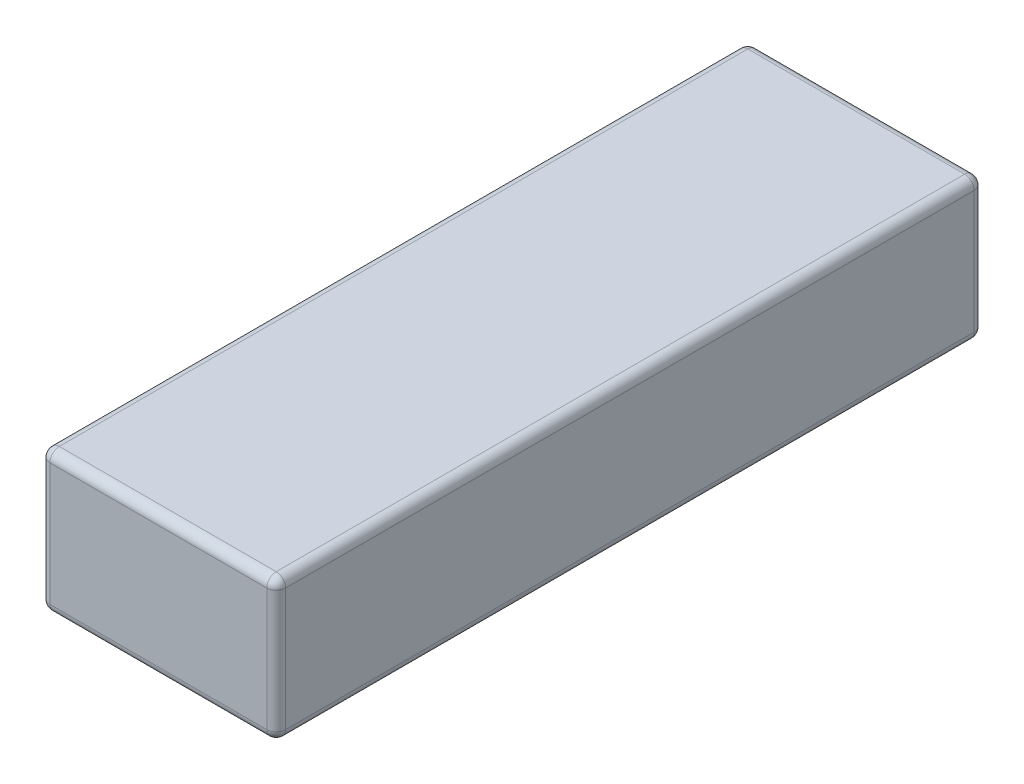
ISO-10303-21;
HEADER;
FILE_DESCRIPTION(('STEP AP214'),'2;1');
FILE_NAME('part.step','',(''),(''),'','','');
FILE_SCHEMA(('AUTOMOTIVE_DESIGN { 1 0 10303 214 1 1 1 1 }'));
ENDSEC;
DATA;
#1=APPLICATION_CONTEXT('core data for automotive mechanical design processes');
#2=APPLICATION_PROTOCOL_DEFINITION('international standard','automotive_design',2000,#1);
#3=PRODUCT_CONTEXT('',#1,'mechanical');
#4=PRODUCT('Part','Part','',(#3));
#5=PRODUCT_RELATED_PRODUCT_CATEGORY('part','',(#4));
#6=PRODUCT_DEFINITION_FORMATION('','',#4);
#7=PRODUCT_DEFINITION_CONTEXT('part definition',#1,'design');
#8=PRODUCT_DEFINITION('design','',#6,#7);
#9=PRODUCT_DEFINITION_SHAPE('','',#8);
#10=(LENGTH_UNIT() NAMED_UNIT(*) SI_UNIT(.MILLI.,.METRE.));
#11=(NAMED_UNIT(*) PLANE_ANGLE_UNIT() SI_UNIT($,.RADIAN.));
#12=(NAMED_UNIT(*) SI_UNIT($,.STERADIAN.) SOLID_ANGLE_UNIT());
#13=UNCERTAINTY_MEASURE_WITH_UNIT(LENGTH_MEASURE(1.E-05),#10,'distance_accuracy_value','');
#14=(GEOMETRIC_REPRESENTATION_CONTEXT(3) GLOBAL_UNCERTAINTY_ASSIGNED_CONTEXT((#13)) GLOBAL_UNIT_ASSIGNED_CONTEXT((#10,
#11,#12)) REPRESENTATION_CONTEXT('',''));
#15=CARTESIAN_POINT('',(0.,0.,0.));
#16=DIRECTION('',(0.,0.,1.));
#17=DIRECTION('',(1.,0.,0.));
#18=AXIS2_PLACEMENT_3D('',#15,#16,#17);
#19=CARTESIAN_POINT('',(-25.,30.,-75.));
#20=DIRECTION('',(0.,0.,1.));
#21=DIRECTION('',(1.,0.,0.));
#22=AXIS2_PLACEMENT_3D('',#19,#20,#21);
#23=PLANE('',#22);
#24=DIRECTION('',(-1.,0.,0.));
#25=VECTOR('',#24,1.);
#26=CARTESIAN_POINT('',(25.,28.,-75.));
#27=LINE('',#26,#25);
#28=CARTESIAN_POINT('',(-23.,28.,-75.));
#29=VERTEX_POINT('',#28);
#30=CARTESIAN_POINT('',(0.,28.,-75.));
#31=VERTEX_POINT('',#30);
#32=EDGE_CURVE('E149',#29,#31,#27,.F.);
#33=ORIENTED_EDGE('',*,*,#32,.T.);
#34=CARTESIAN_POINT('',(0.,15.,-75.));
#35=DIRECTION('',(0.,0.,-1.));
#36=DIRECTION('',(-1.,0.,0.));
#37=AXIS2_PLACEMENT_3D('',#34,#35,#36);
#38=CIRCLE('',#37,13.);
#39=CARTESIAN_POINT('',(0.,2.,-75.));
#40=VERTEX_POINT('',#39);
#41=EDGE_CURVE('E59',#40,#31,#38,.T.);
#42=ORIENTED_EDGE('',*,*,#41,.F.);
#43=DIRECTION('',(-1.,0.,0.));
#44=VECTOR('',#43,1.);
#45=CARTESIAN_POINT('',(-25.,2.,-75.));
#46=LINE('',#45,#44);
#47=CARTESIAN_POINT('',(-23.,2.,-75.));
#48=VERTEX_POINT('',#47);
#49=EDGE_CURVE('E146',#40,#48,#46,.T.);
#50=ORIENTED_EDGE('',*,*,#49,.T.);
#51=DIRECTION('',(0.,-1.,0.));
#52=VECTOR('',#51,1.);
#53=CARTESIAN_POINT('',(-23.,30.,-75.));
#54=LINE('',#53,#52);
#55=EDGE_CURVE('E280',#48,#29,#54,.F.);
#56=ORIENTED_EDGE('',*,*,#55,.T.);
#57=EDGE_LOOP('',(#33,#42,#50,#56));
#58=FACE_BOUND('',#57,.T.);
#59=ADVANCED_FACE('F43',(#58),#23,.F.);
#60=CARTESIAN_POINT('',(25.,30.,-75.));
#61=DIRECTION('',(-1.,0.,0.));
#62=DIRECTION('',(0.,0.,1.));
#63=AXIS2_PLACEMENT_3D('',#60,#61,#62);
#64=PLANE('',#63);
#65=DIRECTION('',(0.,-1.,0.));
#66=VECTOR('',#65,1.);
#67=CARTESIAN_POINT('',(25.,30.,73.));
#68=LINE('',#67,#66);
#69=CARTESIAN_POINT('',(25.,28.,73.));
#70=VERTEX_POINT('',#69);
#71=CARTESIAN_POINT('',(25.,2.,73.));
#72=VERTEX_POINT('',#71);
#73=EDGE_CURVE('E255',#70,#72,#68,.T.);
#74=ORIENTED_EDGE('',*,*,#73,.T.);
#75=DIRECTION('',(0.,0.,-1.));
#76=VECTOR('',#75,1.);
#77=CARTESIAN_POINT('',(25.,2.,-75.));
#78=LINE('',#77,#76);
#79=CARTESIAN_POINT('',(25.,2.,-73.));
#80=VERTEX_POINT('',#79);
#81=EDGE_CURVE('E260',#72,#80,#78,.T.);
#82=ORIENTED_EDGE('',*,*,#81,.T.);
#83=DIRECTION('',(0.,-1.,0.));
#84=VECTOR('',#83,1.);
#85=CARTESIAN_POINT('',(25.,30.,-73.));
#86=LINE('',#85,#84);
#87=CARTESIAN_POINT('',(25.,28.,-73.));
#88=VERTEX_POINT('',#87);
#89=EDGE_CURVE('E250',#80,#88,#86,.F.);
#90=ORIENTED_EDGE('',*,*,#89,.T.);
#91=DIRECTION('',(0.,0.,-1.));
#92=VECTOR('',#91,1.);
#93=CARTESIAN_POINT('',(25.,28.,75.));
#94=LINE('',#93,#92);
#95=EDGE_CURVE('E245',#88,#70,#94,.F.);
#96=ORIENTED_EDGE('',*,*,#95,.T.);
#97=EDGE_LOOP('',(#74,#82,#90,#96));
#98=FACE_BOUND('',#97,.T.);
#99=ADVANCED_FACE('F330',(#98),#64,.F.);
#100=CARTESIAN_POINT('',(23.,2.,-75.));
#101=VERTEX_POINT('',#100);
#102=EDGE_CURVE('E155',#101,#40,#46,.T.);
#103=ORIENTED_EDGE('',*,*,#102,.T.);
#104=EDGE_CURVE('E136',#31,#40,#38,.T.);
#105=ORIENTED_EDGE('',*,*,#104,.F.);
#106=CARTESIAN_POINT('',(23.,28.,-75.));
#107=VERTEX_POINT('',#106);
#108=EDGE_CURVE('E281',#31,#107,#27,.F.);
#109=ORIENTED_EDGE('',*,*,#108,.T.);
#110=DIRECTION('',(0.,-1.,0.));
#111=VECTOR('',#110,1.);
#112=CARTESIAN_POINT('',(23.,30.,-75.));
#113=LINE('',#112,#111);
#114=EDGE_CURVE('E163',#107,#101,#113,.T.);
#115=ORIENTED_EDGE('',*,*,#114,.T.);
#116=EDGE_LOOP('',(#103,#105,#109,#115));
#117=FACE_BOUND('',#116,.T.);
#118=ADVANCED_FACE('F161',(#117),#23,.F.);
#119=CARTESIAN_POINT('',(-25.,30.,-75.));
#120=DIRECTION('',(1.,0.,0.));
#121=DIRECTION('',(0.,0.,-1.));
#122=AXIS2_PLACEMENT_3D('',#119,#120,#121);
#123=PLANE('',#122);
#124=DIRECTION('',(0.,0.,1.));
#125=VECTOR('',#124,1.);
#126=CARTESIAN_POINT('',(-25.,28.,-75.));
#127=LINE('',#126,#125);
#128=CARTESIAN_POINT('',(-25.,28.,73.));
#129=VERTEX_POINT('',#128);
#130=CARTESIAN_POINT('',(-25.,28.,-73.));
#131=VERTEX_POINT('',#130);
#132=EDGE_CURVE('E52',#129,#131,#127,.F.);
#133=ORIENTED_EDGE('',*,*,#132,.T.);
#134=DIRECTION('',(0.,-1.,0.));
#135=VECTOR('',#134,1.);
#136=CARTESIAN_POINT('',(-25.,30.,-73.));
#137=LINE('',#136,#135);
#138=CARTESIAN_POINT('',(-25.,2.,-73.));
#139=VERTEX_POINT('',#138);
#140=EDGE_CURVE('E11',#131,#139,#137,.T.);
#141=ORIENTED_EDGE('',*,*,#140,.T.);
#142=DIRECTION('',(0.,0.,1.));
#143=VECTOR('',#142,1.);
#144=CARTESIAN_POINT('',(-25.,2.,-75.));
#145=LINE('',#144,#143);
#146=CARTESIAN_POINT('',(-25.,2.,73.));
#147=VERTEX_POINT('',#146);
#148=EDGE_CURVE('E177',#139,#147,#145,.T.);
#149=ORIENTED_EDGE('',*,*,#148,.T.);
#150=DIRECTION('',(0.,-1.,0.));
#151=VECTOR('',#150,1.);
#152=CARTESIAN_POINT('',(-25.,30.,73.));
#153=LINE('',#152,#151);
#154=EDGE_CURVE('E179',#147,#129,#153,.F.);
#155=ORIENTED_EDGE('',*,*,#154,.T.);
#156=EDGE_LOOP('',(#133,#141,#149,#155));
#157=FACE_BOUND('',#156,.T.);
#158=ADVANCED_FACE('F339',(#157),#123,.F.);
#159=CARTESIAN_POINT('',(-25.,30.,75.));
#160=DIRECTION('',(0.,0.,-1.));
#161=DIRECTION('',(-1.,0.,0.));
#162=AXIS2_PLACEMENT_3D('',#159,#160,#161);
#163=PLANE('',#162);
#164=DIRECTION('',(1.,0.,0.));
#165=VECTOR('',#164,1.);
#166=CARTESIAN_POINT('',(-25.,2.,75.));
#167=LINE('',#166,#165);
#168=CARTESIAN_POINT('',(-23.,2.,75.));
#169=VERTEX_POINT('',#168);
#170=CARTESIAN_POINT('',(23.,2.,75.));
#171=VERTEX_POINT('',#170);
#172=EDGE_CURVE('E276',#169,#171,#167,.T.);
#173=ORIENTED_EDGE('',*,*,#172,.T.);
#174=DIRECTION('',(0.,-1.,0.));
#175=VECTOR('',#174,1.);
#176=CARTESIAN_POINT('',(23.,30.,75.));
#177=LINE('',#176,#175);
#178=CARTESIAN_POINT('',(23.,28.,75.));
#179=VERTEX_POINT('',#178);
#180=EDGE_CURVE('E278',#171,#179,#177,.F.);
#181=ORIENTED_EDGE('',*,*,#180,.T.);
#182=DIRECTION('',(1.,0.,0.));
#183=VECTOR('',#182,1.);
#184=CARTESIAN_POINT('',(-25.,28.,75.));
#185=LINE('',#184,#183);
#186=CARTESIAN_POINT('',(-23.,28.,75.));
#187=VERTEX_POINT('',#186);
#188=EDGE_CURVE('E274',#179,#187,#185,.F.);
#189=ORIENTED_EDGE('',*,*,#188,.T.);
#190=DIRECTION('',(0.,-1.,0.));
#191=VECTOR('',#190,1.);
#192=CARTESIAN_POINT('',(-23.,30.,75.));
#193=LINE('',#192,#191);
#194=EDGE_CURVE('E272',#187,#169,#193,.T.);
#195=ORIENTED_EDGE('',*,*,#194,.T.);
#196=EDGE_LOOP('',(#173,#181,#189,#195));
#197=FACE_BOUND('',#196,.T.);
#198=ADVANCED_FACE('F344',(#197),#163,.F.);
#199=CARTESIAN_POINT('',(0.,30.,0.));
#200=DIRECTION('',(0.,1.,0.));
#201=DIRECTION('',(0.,0.,1.));
#202=AXIS2_PLACEMENT_3D('',#199,#200,#201);
#203=PLANE('',#202);
#204=DIRECTION('',(1.,0.,0.));
#205=VECTOR('',#204,1.);
#206=CARTESIAN_POINT('',(25.,30.,73.));
#207=LINE('',#206,#205);
#208=CARTESIAN_POINT('',(-23.,30.,73.));
#209=VERTEX_POINT('',#208);
#210=CARTESIAN_POINT('',(23.,30.,73.));
#211=VERTEX_POINT('',#210);
#212=EDGE_CURVE('E172',#209,#211,#207,.T.);
#213=ORIENTED_EDGE('',*,*,#212,.T.);
#214=DIRECTION('',(0.,0.,-1.));
#215=VECTOR('',#214,1.);
#216=CARTESIAN_POINT('',(23.,30.,-75.));
#217=LINE('',#216,#215);
#218=CARTESIAN_POINT('',(23.,30.,-73.));
#219=VERTEX_POINT('',#218);
#220=EDGE_CURVE('E175',#211,#219,#217,.T.);
#221=ORIENTED_EDGE('',*,*,#220,.T.);
#222=DIRECTION('',(-1.,0.,0.));
#223=VECTOR('',#222,1.);
#224=CARTESIAN_POINT('',(-25.,30.,-73.));
#225=LINE('',#224,#223);
#226=CARTESIAN_POINT('',(-23.,30.,-73.));
#227=VERTEX_POINT('',#226);
#228=EDGE_CURVE('E170',#219,#227,#225,.T.);
#229=ORIENTED_EDGE('',*,*,#228,.T.);
#230=DIRECTION('',(0.,0.,1.));
#231=VECTOR('',#230,1.);
#232=CARTESIAN_POINT('',(-23.,30.,75.));
#233=LINE('',#232,#231);
#234=EDGE_CURVE('E164',#227,#209,#233,.T.);
#235=ORIENTED_EDGE('',*,*,#234,.T.);
#236=EDGE_LOOP('',(#213,#221,#229,#235));
#237=FACE_BOUND('',#236,.T.);
#238=ADVANCED_FACE('F348',(#237),#203,.T.);
#239=CARTESIAN_POINT('',(0.,0.,0.));
#240=DIRECTION('',(0.,1.,0.));
#241=DIRECTION('',(0.,0.,1.));
#242=AXIS2_PLACEMENT_3D('',#239,#240,#241);
#243=PLANE('',#242);
#244=DIRECTION('',(-1.,0.,0.));
#245=VECTOR('',#244,1.);
#246=CARTESIAN_POINT('',(0.,0.,-73.));
#247=LINE('',#246,#245);
#248=CARTESIAN_POINT('',(-23.,0.,-73.));
#249=VERTEX_POINT('',#248);
#250=CARTESIAN_POINT('',(23.,0.,-73.));
#251=VERTEX_POINT('',#250);
#252=EDGE_CURVE('E265',#249,#251,#247,.F.);
#253=ORIENTED_EDGE('',*,*,#252,.T.);
#254=DIRECTION('',(0.,0.,-1.));
#255=VECTOR('',#254,1.);
#256=CARTESIAN_POINT('',(23.,0.,0.));
#257=LINE('',#256,#255);
#258=CARTESIAN_POINT('',(23.,0.,73.));
#259=VERTEX_POINT('',#258);
#260=EDGE_CURVE('E269',#251,#259,#257,.F.);
#261=ORIENTED_EDGE('',*,*,#260,.T.);
#262=DIRECTION('',(1.,0.,0.));
#263=VECTOR('',#262,1.);
#264=CARTESIAN_POINT('',(0.,0.,73.));
#265=LINE('',#264,#263);
#266=CARTESIAN_POINT('',(-23.,0.,73.));
#267=VERTEX_POINT('',#266);
#268=EDGE_CURVE('E267',#259,#267,#265,.F.);
#269=ORIENTED_EDGE('',*,*,#268,.T.);
#270=DIRECTION('',(0.,0.,1.));
#271=VECTOR('',#270,1.);
#272=CARTESIAN_POINT('',(-23.,0.,0.));
#273=LINE('',#272,#271);
#274=EDGE_CURVE('E263',#267,#249,#273,.F.);
#275=ORIENTED_EDGE('',*,*,#274,.T.);
#276=EDGE_LOOP('',(#253,#261,#269,#275));
#277=FACE_BOUND('',#276,.T.);
#278=ADVANCED_FACE('F303',(#277),#243,.F.);
#279=CARTESIAN_POINT('',(-23.,28.,0.));
#280=DIRECTION('',(0.,0.,-1.));
#281=DIRECTION('',(-1.,0.,0.));
#282=AXIS2_PLACEMENT_3D('',#279,#280,#281);
#283=CYLINDRICAL_SURFACE('',#282,2.);
#284=CARTESIAN_POINT('',(-23.,28.,73.));
#285=DIRECTION('',(0.,0.,1.));
#286=DIRECTION('',(1.,0.,0.));
#287=AXIS2_PLACEMENT_3D('',#284,#285,#286);
#288=CIRCLE('',#287,2.);
#289=EDGE_CURVE('E47',#209,#129,#288,.T.);
#290=ORIENTED_EDGE('',*,*,#289,.F.);
#291=ORIENTED_EDGE('',*,*,#234,.F.);
#292=CARTESIAN_POINT('',(-23.,28.,-73.));
#293=DIRECTION('',(0.,0.,-1.));
#294=DIRECTION('',(-1.,0.,0.));
#295=AXIS2_PLACEMENT_3D('',#292,#293,#294);
#296=CIRCLE('',#295,2.);
#297=EDGE_CURVE('E239',#131,#227,#296,.T.);
#298=ORIENTED_EDGE('',*,*,#297,.F.);
#299=ORIENTED_EDGE('',*,*,#132,.F.);
#300=EDGE_LOOP('',(#290,#291,#298,#299));
#301=FACE_BOUND('',#300,.T.);
#302=ADVANCED_FACE('F45',(#301),#283,.T.);
#303=CARTESIAN_POINT('',(-23.,28.,73.));
#304=DIRECTION('',(-1.,0.,0.));
#305=DIRECTION('',(0.,0.,1.));
#306=AXIS2_PLACEMENT_3D('',#303,#304,#305);
#307=SPHERICAL_SURFACE('',#306,2.);
#308=CARTESIAN_POINT('',(-23.,28.,73.));
#309=DIRECTION('',(-1.,0.,0.));
#310=DIRECTION('',(0.,0.,1.));
#311=AXIS2_PLACEMENT_3D('',#308,#309,#310);
#312=CIRCLE('',#311,2.);
#313=EDGE_CURVE('E234',#209,#187,#312,.F.);
#314=ORIENTED_EDGE('',*,*,#313,.F.);
#315=ORIENTED_EDGE('',*,*,#289,.T.);
#316=CARTESIAN_POINT('',(-23.,28.,73.));
#317=DIRECTION('',(0.,1.,0.));
#318=DIRECTION('',(0.,0.,1.));
#319=AXIS2_PLACEMENT_3D('',#316,#317,#318);
#320=CIRCLE('',#319,2.);
#321=EDGE_CURVE('E237',#187,#129,#320,.F.);
#322=ORIENTED_EDGE('',*,*,#321,.F.);
#323=EDGE_LOOP('',(#314,#315,#322));
#324=FACE_BOUND('',#323,.T.);
#325=ADVANCED_FACE('F320',(#324),#307,.T.);
#326=CARTESIAN_POINT('',(-23.,28.,-73.));
#327=DIRECTION('',(0.,1.,0.));
#328=DIRECTION('',(0.,0.,1.));
#329=AXIS2_PLACEMENT_3D('',#326,#327,#328);
#330=SPHERICAL_SURFACE('',#329,2.);
#331=CARTESIAN_POINT('',(-23.,28.,-73.));
#332=DIRECTION('',(0.,1.,0.));
#333=DIRECTION('',(0.,0.,1.));
#334=AXIS2_PLACEMENT_3D('',#331,#332,#333);
#335=CIRCLE('',#334,2.);
#336=EDGE_CURVE('E228',#131,#29,#335,.F.);
#337=ORIENTED_EDGE('',*,*,#336,.F.);
#338=ORIENTED_EDGE('',*,*,#297,.T.);
#339=CARTESIAN_POINT('',(-23.,28.,-73.));
#340=DIRECTION('',(-1.,0.,0.));
#341=DIRECTION('',(0.,0.,1.));
#342=AXIS2_PLACEMENT_3D('',#339,#340,#341);
#343=CIRCLE('',#342,2.);
#344=EDGE_CURVE('E231',#29,#227,#343,.F.);
#345=ORIENTED_EDGE('',*,*,#344,.F.);
#346=EDGE_LOOP('',(#337,#338,#345));
#347=FACE_BOUND('',#346,.T.);
#348=ADVANCED_FACE('F317',(#347),#330,.T.);
#349=CARTESIAN_POINT('',(-23.,30.,73.));
#350=DIRECTION('',(0.,-1.,0.));
#351=DIRECTION('',(0.,0.,-1.));
#352=AXIS2_PLACEMENT_3D('',#349,#350,#351);
#353=CYLINDRICAL_SURFACE('',#352,2.);
#354=ORIENTED_EDGE('',*,*,#321,.T.);
#355=ORIENTED_EDGE('',*,*,#154,.F.);
#356=CARTESIAN_POINT('',(-23.,2.,73.));
#357=DIRECTION('',(0.,-1.,0.));
#358=DIRECTION('',(0.,0.,-1.));
#359=AXIS2_PLACEMENT_3D('',#356,#357,#358);
#360=CIRCLE('',#359,2.);
#361=EDGE_CURVE('E222',#169,#147,#360,.T.);
#362=ORIENTED_EDGE('',*,*,#361,.F.);
#363=ORIENTED_EDGE('',*,*,#194,.F.);
#364=EDGE_LOOP('',(#354,#355,#362,#363));
#365=FACE_BOUND('',#364,.T.);
#366=ADVANCED_FACE('F319',(#365),#353,.T.);
#367=CARTESIAN_POINT('',(0.,28.,73.));
#368=DIRECTION('',(-1.,0.,0.));
#369=DIRECTION('',(0.,0.,1.));
#370=AXIS2_PLACEMENT_3D('',#367,#368,#369);
#371=CYLINDRICAL_SURFACE('',#370,2.);
#372=ORIENTED_EDGE('',*,*,#313,.T.);
#373=ORIENTED_EDGE('',*,*,#188,.F.);
#374=CARTESIAN_POINT('',(23.,28.,73.));
#375=DIRECTION('',(1.,0.,0.));
#376=DIRECTION('',(0.,0.,-1.));
#377=AXIS2_PLACEMENT_3D('',#374,#375,#376);
#378=CIRCLE('',#377,2.);
#379=EDGE_CURVE('E219',#211,#179,#378,.T.);
#380=ORIENTED_EDGE('',*,*,#379,.F.);
#381=ORIENTED_EDGE('',*,*,#212,.F.);
#382=EDGE_LOOP('',(#372,#373,#380,#381));
#383=FACE_BOUND('',#382,.T.);
#384=ADVANCED_FACE('F326',(#383),#371,.T.);
#385=CARTESIAN_POINT('',(23.,28.,0.));
#386=DIRECTION('',(0.,0.,1.));
#387=DIRECTION('',(1.,0.,0.));
#388=AXIS2_PLACEMENT_3D('',#385,#386,#387);
#389=CYLINDRICAL_SURFACE('',#388,2.);
#390=CARTESIAN_POINT('',(23.,28.,-73.));
#391=DIRECTION('',(0.,0.,-1.));
#392=DIRECTION('',(-1.,0.,0.));
#393=AXIS2_PLACEMENT_3D('',#390,#391,#392);
#394=CIRCLE('',#393,2.);
#395=EDGE_CURVE('E214',#219,#88,#394,.T.);
#396=ORIENTED_EDGE('',*,*,#395,.F.);
#397=ORIENTED_EDGE('',*,*,#220,.F.);
#398=CARTESIAN_POINT('',(23.,28.,73.));
#399=DIRECTION('',(0.,0.,1.));
#400=DIRECTION('',(1.,0.,0.));
#401=AXIS2_PLACEMENT_3D('',#398,#399,#400);
#402=CIRCLE('',#401,2.);
#403=EDGE_CURVE('E217',#70,#211,#402,.T.);
#404=ORIENTED_EDGE('',*,*,#403,.F.);
#405=ORIENTED_EDGE('',*,*,#95,.F.);
#406=EDGE_LOOP('',(#396,#397,#404,#405));
#407=FACE_BOUND('',#406,.T.);
#408=ADVANCED_FACE('F473',(#407),#389,.T.);
#409=CARTESIAN_POINT('',(0.,28.,-73.));
#410=DIRECTION('',(1.,0.,0.));
#411=DIRECTION('',(0.,0.,-1.));
#412=AXIS2_PLACEMENT_3D('',#409,#410,#411);
#413=CYLINDRICAL_SURFACE('',#412,2.);
#414=ORIENTED_EDGE('',*,*,#344,.T.);
#415=ORIENTED_EDGE('',*,*,#228,.F.);
#416=CARTESIAN_POINT('',(23.,28.,-73.));
#417=DIRECTION('',(1.,0.,0.));
#418=DIRECTION('',(0.,0.,-1.));
#419=AXIS2_PLACEMENT_3D('',#416,#417,#418);
#420=CIRCLE('',#419,2.);
#421=EDGE_CURVE('E211',#107,#219,#420,.T.);
#422=ORIENTED_EDGE('',*,*,#421,.F.);
#423=ORIENTED_EDGE('',*,*,#108,.F.);
#424=ORIENTED_EDGE('',*,*,#32,.F.);
#425=EDGE_LOOP('',(#414,#415,#422,#423,#424));
#426=FACE_BOUND('',#425,.T.);
#427=ADVANCED_FACE('F286',(#426),#413,.T.);
#428=CARTESIAN_POINT('',(-23.,30.,-73.));
#429=DIRECTION('',(0.,-1.,0.));
#430=DIRECTION('',(0.,0.,-1.));
#431=AXIS2_PLACEMENT_3D('',#428,#429,#430);
#432=CYLINDRICAL_SURFACE('',#431,2.);
#433=ORIENTED_EDGE('',*,*,#336,.T.);
#434=ORIENTED_EDGE('',*,*,#55,.F.);
#435=CARTESIAN_POINT('',(-23.,2.,-73.));
#436=DIRECTION('',(0.,-1.,0.));
#437=DIRECTION('',(0.,0.,-1.));
#438=AXIS2_PLACEMENT_3D('',#435,#436,#437);
#439=CIRCLE('',#438,2.);
#440=EDGE_CURVE('E208',#139,#48,#439,.T.);
#441=ORIENTED_EDGE('',*,*,#440,.F.);
#442=ORIENTED_EDGE('',*,*,#140,.F.);
#443=EDGE_LOOP('',(#433,#434,#441,#442));
#444=FACE_BOUND('',#443,.T.);
#445=ADVANCED_FACE('F316',(#444),#432,.T.);
#446=CARTESIAN_POINT('',(-23.,2.,-75.));
#447=DIRECTION('',(0.,0.,1.));
#448=DIRECTION('',(1.,0.,0.));
#449=AXIS2_PLACEMENT_3D('',#446,#447,#448);
#450=CYLINDRICAL_SURFACE('',#449,2.);
#451=CARTESIAN_POINT('',(-23.,2.,73.));
#452=DIRECTION('',(0.,0.,1.));
#453=DIRECTION('',(1.,0.,0.));
#454=AXIS2_PLACEMENT_3D('',#451,#452,#453);
#455=CIRCLE('',#454,2.);
#456=EDGE_CURVE('E225',#147,#267,#455,.T.);
#457=ORIENTED_EDGE('',*,*,#456,.F.);
#458=ORIENTED_EDGE('',*,*,#148,.F.);
#459=CARTESIAN_POINT('',(-23.,2.,-73.));
#460=DIRECTION('',(0.,0.,-1.));
#461=DIRECTION('',(-1.,0.,0.));
#462=AXIS2_PLACEMENT_3D('',#459,#460,#461);
#463=CIRCLE('',#462,2.);
#464=EDGE_CURVE('E206',#249,#139,#463,.T.);
#465=ORIENTED_EDGE('',*,*,#464,.F.);
#466=ORIENTED_EDGE('',*,*,#274,.F.);
#467=EDGE_LOOP('',(#457,#458,#465,#466));
#468=FACE_BOUND('',#467,.T.);
#469=ADVANCED_FACE('F310',(#468),#450,.T.);
#470=CARTESIAN_POINT('',(-23.,2.,73.));
#471=DIRECTION('',(-1.,0.,0.));
#472=DIRECTION('',(0.,-1.,0.));
#473=AXIS2_PLACEMENT_3D('',#470,#471,#472);
#474=SPHERICAL_SURFACE('',#473,2.);
#475=ORIENTED_EDGE('',*,*,#361,.T.);
#476=ORIENTED_EDGE('',*,*,#456,.T.);
#477=CARTESIAN_POINT('',(-23.,2.,73.));
#478=DIRECTION('',(-1.,0.,0.));
#479=DIRECTION('',(0.,0.,1.));
#480=AXIS2_PLACEMENT_3D('',#477,#478,#479);
#481=CIRCLE('',#480,2.);
#482=EDGE_CURVE('E203',#169,#267,#481,.F.);
#483=ORIENTED_EDGE('',*,*,#482,.F.);
#484=EDGE_LOOP('',(#475,#476,#483));
#485=FACE_BOUND('',#484,.T.);
#486=ADVANCED_FACE('F445',(#485),#474,.T.);
#487=CARTESIAN_POINT('',(23.,28.,73.));
#488=DIRECTION('',(0.,1.,0.));
#489=DIRECTION('',(0.,0.,1.));
#490=AXIS2_PLACEMENT_3D('',#487,#488,#489);
#491=SPHERICAL_SURFACE('',#490,2.);
#492=ORIENTED_EDGE('',*,*,#403,.T.);
#493=ORIENTED_EDGE('',*,*,#379,.T.);
#494=CARTESIAN_POINT('',(23.,28.,73.));
#495=DIRECTION('',(0.,1.,0.));
#496=DIRECTION('',(0.,0.,1.));
#497=AXIS2_PLACEMENT_3D('',#494,#495,#496);
#498=CIRCLE('',#497,2.);
#499=EDGE_CURVE('E201',#70,#179,#498,.F.);
#500=ORIENTED_EDGE('',*,*,#499,.F.);
#501=EDGE_LOOP('',(#492,#493,#500));
#502=FACE_BOUND('',#501,.T.);
#503=ADVANCED_FACE('F438',(#502),#491,.T.);
#504=CARTESIAN_POINT('',(23.,28.,-73.));
#505=DIRECTION('',(0.,1.,0.));
#506=DIRECTION('',(0.,0.,1.));
#507=AXIS2_PLACEMENT_3D('',#504,#505,#506);
#508=SPHERICAL_SURFACE('',#507,2.);
#509=ORIENTED_EDGE('',*,*,#421,.T.);
#510=ORIENTED_EDGE('',*,*,#395,.T.);
#511=CARTESIAN_POINT('',(23.,28.,-73.));
#512=DIRECTION('',(0.,1.,0.));
#513=DIRECTION('',(0.,0.,1.));
#514=AXIS2_PLACEMENT_3D('',#511,#512,#513);
#515=CIRCLE('',#514,2.);
#516=EDGE_CURVE('E198',#107,#88,#515,.F.);
#517=ORIENTED_EDGE('',*,*,#516,.F.);
#518=EDGE_LOOP('',(#509,#510,#517));
#519=FACE_BOUND('',#518,.T.);
#520=ADVANCED_FACE('F289',(#519),#508,.T.);
#521=CARTESIAN_POINT('',(-23.,2.,-73.));
#522=DIRECTION('',(-1.,0.,0.));
#523=DIRECTION('',(0.,-1.,0.));
#524=AXIS2_PLACEMENT_3D('',#521,#522,#523);
#525=SPHERICAL_SURFACE('',#524,2.);
#526=ORIENTED_EDGE('',*,*,#464,.T.);
#527=ORIENTED_EDGE('',*,*,#440,.T.);
#528=CARTESIAN_POINT('',(-23.,2.,-73.));
#529=DIRECTION('',(-1.,0.,0.));
#530=DIRECTION('',(0.,0.,1.));
#531=AXIS2_PLACEMENT_3D('',#528,#529,#530);
#532=CIRCLE('',#531,2.);
#533=EDGE_CURVE('E159',#249,#48,#532,.F.);
#534=ORIENTED_EDGE('',*,*,#533,.F.);
#535=EDGE_LOOP('',(#526,#527,#534));
#536=FACE_BOUND('',#535,.T.);
#537=ADVANCED_FACE('F313',(#536),#525,.T.);
#538=CARTESIAN_POINT('',(-25.,2.,73.));
#539=DIRECTION('',(1.,0.,0.));
#540=DIRECTION('',(0.,0.,-1.));
#541=AXIS2_PLACEMENT_3D('',#538,#539,#540);
#542=CYLINDRICAL_SURFACE('',#541,2.);
#543=ORIENTED_EDGE('',*,*,#482,.T.);
#544=ORIENTED_EDGE('',*,*,#268,.F.);
#545=CARTESIAN_POINT('',(23.,2.,73.));
#546=DIRECTION('',(1.,0.,0.));
#547=DIRECTION('',(0.,0.,-1.));
#548=AXIS2_PLACEMENT_3D('',#545,#546,#547);
#549=CIRCLE('',#548,2.);
#550=EDGE_CURVE('E194',#171,#259,#549,.T.);
#551=ORIENTED_EDGE('',*,*,#550,.F.);
#552=ORIENTED_EDGE('',*,*,#172,.F.);
#553=EDGE_LOOP('',(#543,#544,#551,#552));
#554=FACE_BOUND('',#553,.T.);
#555=ADVANCED_FACE('F417',(#554),#542,.T.);
#556=CARTESIAN_POINT('',(23.,30.,73.));
#557=DIRECTION('',(0.,-1.,0.));
#558=DIRECTION('',(0.,0.,-1.));
#559=AXIS2_PLACEMENT_3D('',#556,#557,#558);
#560=CYLINDRICAL_SURFACE('',#559,2.);
#561=ORIENTED_EDGE('',*,*,#499,.T.);
#562=ORIENTED_EDGE('',*,*,#180,.F.);
#563=CARTESIAN_POINT('',(23.,2.,73.));
#564=DIRECTION('',(0.,-1.,0.));
#565=DIRECTION('',(0.,0.,-1.));
#566=AXIS2_PLACEMENT_3D('',#563,#564,#565);
#567=CIRCLE('',#566,2.);
#568=EDGE_CURVE('E191',#72,#171,#567,.T.);
#569=ORIENTED_EDGE('',*,*,#568,.F.);
#570=ORIENTED_EDGE('',*,*,#73,.F.);
#571=EDGE_LOOP('',(#561,#562,#569,#570));
#572=FACE_BOUND('',#571,.T.);
#573=ADVANCED_FACE('F411',(#572),#560,.T.);
#574=CARTESIAN_POINT('',(23.,30.,-73.));
#575=DIRECTION('',(0.,-1.,0.));
#576=DIRECTION('',(0.,0.,-1.));
#577=AXIS2_PLACEMENT_3D('',#574,#575,#576);
#578=CYLINDRICAL_SURFACE('',#577,2.);
#579=ORIENTED_EDGE('',*,*,#516,.T.);
#580=ORIENTED_EDGE('',*,*,#89,.F.);
#581=CARTESIAN_POINT('',(23.,2.,-73.));
#582=DIRECTION('',(0.,-1.,0.));
#583=DIRECTION('',(0.,0.,-1.));
#584=AXIS2_PLACEMENT_3D('',#581,#582,#583);
#585=CIRCLE('',#584,2.);
#586=EDGE_CURVE('E188',#101,#80,#585,.T.);
#587=ORIENTED_EDGE('',*,*,#586,.F.);
#588=ORIENTED_EDGE('',*,*,#114,.F.);
#589=EDGE_LOOP('',(#579,#580,#587,#588));
#590=FACE_BOUND('',#589,.T.);
#591=ADVANCED_FACE('F293',(#590),#578,.T.);
#592=CARTESIAN_POINT('',(-25.,2.,-73.));
#593=DIRECTION('',(-1.,0.,0.));
#594=DIRECTION('',(0.,0.,1.));
#595=AXIS2_PLACEMENT_3D('',#592,#593,#594);
#596=CYLINDRICAL_SURFACE('',#595,2.);
#597=ORIENTED_EDGE('',*,*,#533,.T.);
#598=ORIENTED_EDGE('',*,*,#49,.F.);
#599=ORIENTED_EDGE('',*,*,#102,.F.);
#600=CARTESIAN_POINT('',(23.,2.,-73.));
#601=DIRECTION('',(1.,0.,0.));
#602=DIRECTION('',(0.,0.,-1.));
#603=AXIS2_PLACEMENT_3D('',#600,#601,#602);
#604=CIRCLE('',#603,2.);
#605=EDGE_CURVE('E186',#251,#101,#604,.T.);
#606=ORIENTED_EDGE('',*,*,#605,.F.);
#607=ORIENTED_EDGE('',*,*,#252,.F.);
#608=EDGE_LOOP('',(#597,#598,#599,#606,#607));
#609=FACE_BOUND('',#608,.T.);
#610=ADVANCED_FACE('F153',(#609),#596,.T.);
#611=CARTESIAN_POINT('',(23.,2.,73.));
#612=DIRECTION('',(0.,0.,1.));
#613=DIRECTION('',(0.,-1.,0.));
#614=AXIS2_PLACEMENT_3D('',#611,#612,#613);
#615=SPHERICAL_SURFACE('',#614,2.);
#616=ORIENTED_EDGE('',*,*,#568,.T.);
#617=ORIENTED_EDGE('',*,*,#550,.T.);
#618=CARTESIAN_POINT('',(23.,2.,73.));
#619=DIRECTION('',(0.,0.,1.));
#620=DIRECTION('',(1.,0.,0.));
#621=AXIS2_PLACEMENT_3D('',#618,#619,#620);
#622=CIRCLE('',#621,2.);
#623=EDGE_CURVE('E184',#72,#259,#622,.F.);
#624=ORIENTED_EDGE('',*,*,#623,.F.);
#625=EDGE_LOOP('',(#616,#617,#624));
#626=FACE_BOUND('',#625,.T.);
#627=ADVANCED_FACE('F388',(#626),#615,.T.);
#628=CARTESIAN_POINT('',(23.,2.,-73.));
#629=DIRECTION('',(0.,0.,-1.));
#630=DIRECTION('',(0.,1.,0.));
#631=AXIS2_PLACEMENT_3D('',#628,#629,#630);
#632=SPHERICAL_SURFACE('',#631,2.);
#633=ORIENTED_EDGE('',*,*,#605,.T.);
#634=ORIENTED_EDGE('',*,*,#586,.T.);
#635=CARTESIAN_POINT('',(23.,2.,-73.));
#636=DIRECTION('',(0.,0.,-1.));
#637=DIRECTION('',(-1.,0.,0.));
#638=AXIS2_PLACEMENT_3D('',#635,#636,#637);
#639=CIRCLE('',#638,2.);
#640=EDGE_CURVE('E182',#251,#80,#639,.F.);
#641=ORIENTED_EDGE('',*,*,#640,.F.);
#642=EDGE_LOOP('',(#633,#634,#641));
#643=FACE_BOUND('',#642,.T.);
#644=ADVANCED_FACE('F296',(#643),#632,.T.);
#645=CARTESIAN_POINT('',(23.,2.,-75.));
#646=DIRECTION('',(0.,0.,-1.));
#647=DIRECTION('',(-1.,0.,0.));
#648=AXIS2_PLACEMENT_3D('',#645,#646,#647);
#649=CYLINDRICAL_SURFACE('',#648,2.);
#650=ORIENTED_EDGE('',*,*,#623,.T.);
#651=ORIENTED_EDGE('',*,*,#260,.F.);
#652=ORIENTED_EDGE('',*,*,#640,.T.);
#653=ORIENTED_EDGE('',*,*,#81,.F.);
#654=EDGE_LOOP('',(#650,#651,#652,#653));
#655=FACE_BOUND('',#654,.T.);
#656=ADVANCED_FACE('F299',(#655),#649,.T.);
#657=CARTESIAN_POINT('',(0.,15.,-74.7));
#658=DIRECTION('',(0.,0.,-1.));
#659=DIRECTION('',(-1.,0.,0.));
#660=AXIS2_PLACEMENT_3D('',#657,#658,#659);
#661=CYLINDRICAL_SURFACE('',#660,13.);
#662=CARTESIAN_POINT('',(0.,15.,-74.7));
#663=DIRECTION('',(0.,0.,-1.));
#664=DIRECTION('',(-1.,0.,0.));
#665=AXIS2_PLACEMENT_3D('',#662,#663,#664);
#666=CIRCLE('',#665,13.);
#667=CARTESIAN_POINT('',(-13.,15.,-74.7));
#668=VERTEX_POINT('',#667);
#669=EDGE_CURVE('E141',#668,#668,#666,.T.);
#670=ORIENTED_EDGE('',*,*,#669,.F.);
#671=EDGE_LOOP('',(#670));
#672=FACE_BOUND('',#671,.T.);
#673=ORIENTED_EDGE('',*,*,#104,.T.);
#674=ORIENTED_EDGE('',*,*,#41,.T.);
#675=EDGE_LOOP('',(#673,#674));
#676=FACE_BOUND('',#675,.T.);
#677=ADVANCED_FACE('F137',(#672,#676),#661,.F.);
#678=CARTESIAN_POINT('',(0.,15.,-74.7));
#679=DIRECTION('',(0.,0.,-1.));
#680=DIRECTION('',(-1.,0.,0.));
#681=AXIS2_PLACEMENT_3D('',#678,#679,#680);
#682=PLANE('',#681);
#683=ORIENTED_EDGE('',*,*,#669,.T.);
#684=EDGE_LOOP('',(#683));
#685=FACE_BOUND('',#684,.T.);
#686=ADVANCED_FACE('F359',(#685),#682,.T.);
#687=CLOSED_SHELL('',(#59,#99,#118,#158,#198,#238,#278,#302,#325,#348,#366,#384,#408,#427,#445,
#469,#486,#503,#520,#537,#555,#573,#591,#610,#627,#644,#656,#677,#686));
#688=MANIFOLD_SOLID_BREP('B2',#687);
#689=ADVANCED_BREP_SHAPE_REPRESENTATION('',(#18,#688),#14);
#690=SHAPE_DEFINITION_REPRESENTATION(#9,#689);
ENDSEC;
END-ISO-10303-21;
